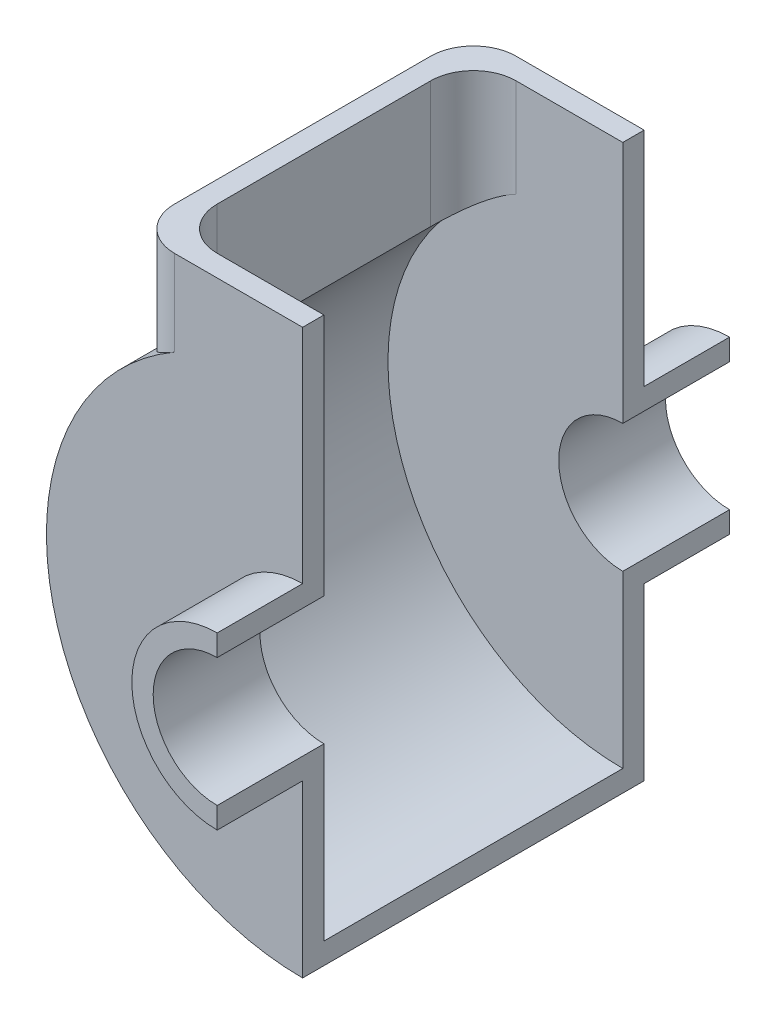
ISO-10303-21;
HEADER;
FILE_DESCRIPTION(('STEP AP214'),'2;1');
FILE_NAME('part.step','',(''),(''),'','','');
FILE_SCHEMA(('AUTOMOTIVE_DESIGN { 1 0 10303 214 1 1 1 1 }'));
ENDSEC;
DATA;
#1=APPLICATION_CONTEXT('core data for automotive mechanical design processes');
#2=APPLICATION_PROTOCOL_DEFINITION('international standard','automotive_design',2000,#1);
#3=PRODUCT_CONTEXT('',#1,'mechanical');
#4=PRODUCT('Part','Part','',(#3));
#5=PRODUCT_RELATED_PRODUCT_CATEGORY('part','',(#4));
#6=PRODUCT_DEFINITION_FORMATION('','',#4);
#7=PRODUCT_DEFINITION_CONTEXT('part definition',#1,'design');
#8=PRODUCT_DEFINITION('design','',#6,#7);
#9=PRODUCT_DEFINITION_SHAPE('','',#8);
#10=(LENGTH_UNIT() NAMED_UNIT(*) SI_UNIT(.MILLI.,.METRE.));
#11=(NAMED_UNIT(*) PLANE_ANGLE_UNIT() SI_UNIT($,.RADIAN.));
#12=(NAMED_UNIT(*) SI_UNIT($,.STERADIAN.) SOLID_ANGLE_UNIT());
#13=UNCERTAINTY_MEASURE_WITH_UNIT(LENGTH_MEASURE(1.E-05),#10,'distance_accuracy_value','');
#14=(GEOMETRIC_REPRESENTATION_CONTEXT(3) GLOBAL_UNCERTAINTY_ASSIGNED_CONTEXT((#13)) GLOBAL_UNIT_ASSIGNED_CONTEXT((#10,
#11,#12)) REPRESENTATION_CONTEXT('',''));
#15=CARTESIAN_POINT('',(0.,0.,0.));
#16=DIRECTION('',(0.,0.,1.));
#17=DIRECTION('',(1.,0.,0.));
#18=AXIS2_PLACEMENT_3D('',#15,#16,#17);
#19=CARTESIAN_POINT('',(0.,0.,0.));
#20=DIRECTION('',(0.,0.,1.));
#21=DIRECTION('',(1.,0.,0.));
#22=AXIS2_PLACEMENT_3D('',#19,#20,#21);
#23=PLANE('',#22);
#24=CARTESIAN_POINT('',(0.,0.,0.));
#25=DIRECTION('',(0.,0.,1.));
#26=DIRECTION('',(1.,0.,0.));
#27=AXIS2_PLACEMENT_3D('',#24,#25,#26);
#28=CIRCLE('',#27,55.);
#29=CARTESIAN_POINT('',(-25.,48.9897948556636,0.));
#30=VERTEX_POINT('',#29);
#31=CARTESIAN_POINT('',(0.,-55.,0.));
#32=VERTEX_POINT('',#31);
#33=EDGE_CURVE('E262',#30,#32,#28,.T.);
#34=ORIENTED_EDGE('',*,*,#33,.F.);
#35=DIRECTION('',(0.,-1.,0.));
#36=VECTOR('',#35,1.);
#37=CARTESIAN_POINT('',(-25.,72.,0.));
#38=LINE('',#37,#36);
#39=CARTESIAN_POINT('',(-25.,72.,0.));
#40=VERTEX_POINT('',#39);
#41=EDGE_CURVE('E406',#30,#40,#38,.F.);
#42=ORIENTED_EDGE('',*,*,#41,.T.);
#43=DIRECTION('',(-1.,0.,0.));
#44=VECTOR('',#43,1.);
#45=CARTESIAN_POINT('',(0.,72.,0.));
#46=LINE('',#45,#44);
#47=CARTESIAN_POINT('',(0.,72.,0.));
#48=VERTEX_POINT('',#47);
#49=EDGE_CURVE('E318',#48,#40,#46,.T.);
#50=ORIENTED_EDGE('',*,*,#49,.F.);
#51=DIRECTION('',(0.,1.,0.));
#52=VECTOR('',#51,1.);
#53=CARTESIAN_POINT('',(0.,0.,0.));
#54=LINE('',#53,#52);
#55=CARTESIAN_POINT('',(0.,15.,0.));
#56=VERTEX_POINT('',#55);
#57=EDGE_CURVE('E335',#56,#48,#54,.T.);
#58=ORIENTED_EDGE('',*,*,#57,.F.);
#59=CARTESIAN_POINT('',(0.,0.,0.));
#60=DIRECTION('',(0.,0.,1.));
#61=DIRECTION('',(1.,0.,0.));
#62=AXIS2_PLACEMENT_3D('',#59,#60,#61);
#63=CIRCLE('',#62,15.);
#64=CARTESIAN_POINT('',(0.,-15.,0.));
#65=VERTEX_POINT('',#64);
#66=EDGE_CURVE('E266',#56,#65,#63,.T.);
#67=ORIENTED_EDGE('',*,*,#66,.T.);
#68=DIRECTION('',(0.,-1.,0.));
#69=VECTOR('',#68,1.);
#70=CARTESIAN_POINT('',(0.,0.,0.));
#71=LINE('',#70,#69);
#72=EDGE_CURVE('E313',#65,#32,#71,.T.);
#73=ORIENTED_EDGE('',*,*,#72,.T.);
#74=EDGE_LOOP('',(#34,#42,#50,#58,#67,#73));
#75=FACE_BOUND('',#74,.T.);
#76=ADVANCED_FACE('F45',(#75),#23,.F.);
#77=CARTESIAN_POINT('',(-40.,0.,5.));
#78=DIRECTION('',(1.,0.,0.));
#79=DIRECTION('',(0.,1.,0.));
#80=AXIS2_PLACEMENT_3D('',#77,#78,#79);
#81=PLANE('',#80);
#82=DIRECTION('',(0.,0.,-1.));
#83=VECTOR('',#82,1.);
#84=CARTESIAN_POINT('',(-40.,44.7213595499958,5.));
#85=LINE('',#84,#83);
#86=CARTESIAN_POINT('',(-40.,44.7213595499958,-5.));
#87=VERTEX_POINT('',#86);
#88=CARTESIAN_POINT('',(-40.,44.7213595499958,-65.));
#89=VERTEX_POINT('',#88);
#90=EDGE_CURVE('E350',#87,#89,#85,.T.);
#91=ORIENTED_EDGE('',*,*,#90,.F.);
#92=DIRECTION('',(0.,-1.,0.));
#93=VECTOR('',#92,1.);
#94=CARTESIAN_POINT('',(-40.,72.,-5.));
#95=LINE('',#94,#93);
#96=CARTESIAN_POINT('',(-40.,72.,-5.));
#97=VERTEX_POINT('',#96);
#98=EDGE_CURVE('E466',#87,#97,#95,.F.);
#99=ORIENTED_EDGE('',*,*,#98,.T.);
#100=DIRECTION('',(0.,0.,-1.));
#101=VECTOR('',#100,1.);
#102=CARTESIAN_POINT('',(-40.,72.,5.));
#103=LINE('',#102,#101);
#104=CARTESIAN_POINT('',(-40.,72.,-65.));
#105=VERTEX_POINT('',#104);
#106=EDGE_CURVE('E332',#97,#105,#103,.T.);
#107=ORIENTED_EDGE('',*,*,#106,.T.);
#108=DIRECTION('',(0.,-1.,0.));
#109=VECTOR('',#108,1.);
#110=CARTESIAN_POINT('',(-40.,44.7213595499958,-65.));
#111=LINE('',#110,#109);
#112=EDGE_CURVE('E353',#105,#89,#111,.T.);
#113=ORIENTED_EDGE('',*,*,#112,.T.);
#114=EDGE_LOOP('',(#91,#99,#107,#113));
#115=FACE_BOUND('',#114,.T.);
#116=ADVANCED_FACE('F386',(#115),#81,.F.);
#117=CARTESIAN_POINT('',(0.,0.,5.));
#118=DIRECTION('',(0.,0.,-1.));
#119=DIRECTION('',(-1.,0.,0.));
#120=AXIS2_PLACEMENT_3D('',#117,#118,#119);
#121=CYLINDRICAL_SURFACE('',#120,60.);
#122=CARTESIAN_POINT('',(0.,0.,5.));
#123=DIRECTION('',(0.,0.,1.));
#124=DIRECTION('',(1.,0.,0.));
#125=AXIS2_PLACEMENT_3D('',#122,#123,#124);
#126=CIRCLE('',#125,60.);
#127=CARTESIAN_POINT('',(-30.,51.9615242270663,5.));
#128=VERTEX_POINT('',#127);
#129=CARTESIAN_POINT('',(0.,-60.,5.));
#130=VERTEX_POINT('',#129);
#131=EDGE_CURVE('E314',#128,#130,#126,.T.);
#132=ORIENTED_EDGE('',*,*,#131,.F.);
#133=CARTESIAN_POINT('',(-30.,51.9615242270663,5.));
#134=CARTESIAN_POINT('',(-30.1846403402757,51.8549243575684,4.99999694467445));
#135=CARTESIAN_POINT('',(-30.3686755821332,51.7473565843307,4.99488587812623));
#136=CARTESIAN_POINT('',(-30.7351668388072,51.5305231450817,4.97462918627216));
#137=CARTESIAN_POINT('',(-30.9176229894397,51.4212576273974,4.95948443281986));
#138=CARTESIAN_POINT('',(-31.4619253243051,51.0913595980358,4.89929167200636));
#139=CARTESIAN_POINT('',(-31.8209014856786,50.868512343648,4.83948477245505));
#140=CARTESIAN_POINT('',(-32.5288887310146,50.418725257113,4.6817684192746));
#141=CARTESIAN_POINT('',(-32.8778736192083,50.1917768316844,4.5837671788936));
#142=CARTESIAN_POINT('',(-33.562476910193,49.7365966241752,4.35090696893926));
#143=CARTESIAN_POINT('',(-33.8980954977704,49.5083648598861,4.21604850911225));
#144=CARTESIAN_POINT('',(-34.520729602458,49.0759439346811,3.92574534472068));
#145=CARTESIAN_POINT('',(-34.8092512536601,48.8716304811259,3.77370267176126));
#146=CARTESIAN_POINT('',(-35.3716903107987,48.4661085573826,3.44107089228342));
#147=CARTESIAN_POINT('',(-35.6456079007732,48.2649000480892,3.26048214561176));
#148=CARTESIAN_POINT('',(-36.1765727574088,47.8682074936152,2.87135112309205));
#149=CARTESIAN_POINT('',(-36.4336405194033,47.6727166603459,2.66284378257166));
#150=CARTESIAN_POINT('',(-36.9290721152615,47.289972828363,2.21794621899144));
#151=CARTESIAN_POINT('',(-37.167441451851,47.1027174132443,1.98156425075618));
#152=CARTESIAN_POINT('',(-37.565018182153,46.785859634165,1.54478146403292));
#153=CARTESIAN_POINT('',(-37.7289458526818,46.6537017113221,1.35050833176436));
#154=CARTESIAN_POINT('',(-38.043765038696,46.397339573439,0.946710505836686));
#155=CARTESIAN_POINT('',(-38.1946575996422,46.2731347207424,0.737187037795445));
#156=CARTESIAN_POINT('',(-38.4818360085844,46.0345861261904,0.303399948510736));
#157=CARTESIAN_POINT('',(-38.618136880254,45.9202322658759,0.0791518792914335));
#158=CARTESIAN_POINT('',(-38.8746918035924,45.7032445431668,-0.383743447816966));
#159=CARTESIAN_POINT('',(-38.9949492411763,45.6006082084878,-0.62238765196006));
#160=CARTESIAN_POINT('',(-39.1965662504922,45.4273417305266,-1.06669402634214));
#161=CARTESIAN_POINT('',(-39.2809795718103,45.3543309967536,-1.27004581930021));
#162=CARTESIAN_POINT('',(-39.437114382813,45.2186323209963,-1.68488791321454));
#163=CARTESIAN_POINT('',(-39.508838494378,45.1559422467147,-1.89637652189831));
#164=CARTESIAN_POINT('',(-39.6385128100447,45.0421551914612,-2.32617263610176));
#165=CARTESIAN_POINT('',(-39.6964869139818,44.9910381018204,-2.54446755239787));
#166=CARTESIAN_POINT('',(-39.7978943535571,44.9013606141582,-2.98685266600599));
#167=CARTESIAN_POINT('',(-39.8413328734582,44.8627957393971,-3.21094076633609));
#168=CARTESIAN_POINT('',(-39.9177189665931,44.7948514731765,-3.6937744282411));
#169=CARTESIAN_POINT('',(-39.9484884415044,44.7673886419263,-3.95314914513774));
#170=CARTESIAN_POINT('',(-39.9793476433001,44.7398248250479,-4.34440444684135));
#171=CARTESIAN_POINT('',(-39.987084921451,44.7329085695169,-4.47527578752073));
#172=CARTESIAN_POINT('',(-39.9974129661721,44.7236736235071,-4.73742237599204));
#173=CARTESIAN_POINT('',(-40.0000021863485,44.7213563144782,-4.86869773328782));
#174=CARTESIAN_POINT('',(-40.,44.7213595499958,-5.));
#175=B_SPLINE_CURVE_WITH_KNOTS('',3,(#133,#134,#135,#136,#137,#138,#139,#140,#141,#142,#143,
#144,#145,#146,#147,#148,#149,#150,#151,#152,#153,#154,#155,#156,#157,#158,#159,#160,#161,#162,
#163,#164,#165,#166,#167,#168,#169,#170,#171,#172,#173,#174),.UNSPECIFIED.,.F.,.F.,(4,2,2,2,2,2,
2,2,2,2,2,2,2,2,2,2,2,2,2,2,4),(0.,0.639469988122806,1.27888441829631,2.55703672344089,
3.83827975129429,5.11950506007104,6.27274736359203,7.42597513070353,8.5777730871098,
9.72923080131074,10.5879927572485,11.4466857734357,12.3044859953459,13.1621048939207,
13.8573439066469,14.5524390989254,15.2463170957639,15.9399473495783,16.7262834977137,
17.1199731890566,17.5137811205932),.UNSPECIFIED.);
#176=EDGE_CURVE('E393',#128,#87,#175,.T.);
#177=ORIENTED_EDGE('',*,*,#176,.T.);
#178=ORIENTED_EDGE('',*,*,#90,.T.);
#179=CARTESIAN_POINT('',(-40.,44.7213595499958,-65.));
#180=CARTESIAN_POINT('',(-40.0000015812733,44.7213573011344,-65.1176634010021));
#181=CARTESIAN_POINT('',(-39.9979227141808,44.7232176305845,-65.2353086549857));
#182=CARTESIAN_POINT('',(-39.9896253110866,44.7306372942271,-65.4703286016599));
#183=CARTESIAN_POINT('',(-39.9834070494192,44.7361963832882,-65.5877033117632));
#184=CARTESIAN_POINT('',(-39.9585923280535,44.7583670958171,-65.9388427467586));
#185=CARTESIAN_POINT('',(-39.9338358355778,44.7804722797486,-66.1718758054602));
#186=CARTESIAN_POINT('',(-39.8686644525486,44.8385042167555,-66.6318691326489));
#187=CARTESIAN_POINT('',(-39.8283855148165,44.8743109465834,-66.8588643223737));
#188=CARTESIAN_POINT('',(-39.7328892662281,44.9588875680342,-67.3072524479117));
#189=CARTESIAN_POINT('',(-39.6776696039361,45.0076595001554,-67.5286444958756));
#190=CARTESIAN_POINT('',(-39.5534118644793,45.1168972505339,-67.9636688649734));
#191=CARTESIAN_POINT('',(-39.4844211995899,45.1773229225701,-68.1773249178853));
#192=CARTESIAN_POINT('',(-39.3334605195833,45.3088170177995,-68.5966936542645));
#193=CARTESIAN_POINT('',(-39.2514857085459,45.3798893730022,-68.8024033675523));
#194=CARTESIAN_POINT('',(-39.0753863002099,45.5316122169457,-69.2054529377369));
#195=CARTESIAN_POINT('',(-38.9812363061758,45.6122826978885,-69.4027741200323));
#196=CARTESIAN_POINT('',(-38.7818943790383,45.7818938454653,-69.7880467498959));
#197=CARTESIAN_POINT('',(-38.6767013504078,45.8708353325264,-69.9759972651116));
#198=CARTESIAN_POINT('',(-38.4135728743112,46.0916172160901,-70.4129070483267));
#199=CARTESIAN_POINT('',(-38.2509572804996,46.2267600621542,-70.6573967975822));
#200=CARTESIAN_POINT('',(-37.908447036405,46.5080507377658,-71.1270697633622));
#201=CARTESIAN_POINT('',(-37.728551713043,46.6541989959475,-71.3522522271834));
#202=CARTESIAN_POINT('',(-37.3531054007839,46.9553345195759,-71.783333742699));
#203=CARTESIAN_POINT('',(-37.1575367002328,47.1103317262239,-71.9892103913973));
#204=CARTESIAN_POINT('',(-36.7525951751676,47.4269223387039,-72.3811838692743));
#205=CARTESIAN_POINT('',(-36.5432234671629,47.5885152106185,-72.5672822951176));
#206=CARTESIAN_POINT('',(-35.889352420626,48.0859277319981,-73.1015951815724));
#207=CARTESIAN_POINT('',(-35.4251261289153,48.429498559668,-73.4189829871174));
#208=CARTESIAN_POINT('',(-34.4553726874119,49.1241578823887,-73.9699716496598));
#209=CARTESIAN_POINT('',(-33.9498747171002,49.4752409388269,-74.2036310842669));
#210=CARTESIAN_POINT('',(-33.1568278633415,50.0073212539565,-74.4930456878643));
#211=CARTESIAN_POINT('',(-32.8810021018505,50.1891501210001,-74.5803819665683));
#212=CARTESIAN_POINT('',(-32.3217375725054,50.5511235483305,-74.7310524671282));
#213=CARTESIAN_POINT('',(-32.0382991780871,50.7312681906542,-74.7943878640466));
#214=CARTESIAN_POINT('',(-31.4650006560555,51.0888227050653,-74.8963939978526));
#215=CARTESIAN_POINT('',(-31.1751356203563,51.2662302982853,-74.935045161166));
#216=CARTESIAN_POINT('',(-30.5906934832528,51.6171131325133,-74.9868485137105));
#217=CARTESIAN_POINT('',(-30.2961152167169,51.7905873747387,-74.9999942965489));
#218=CARTESIAN_POINT('',(-30.,51.9615242270663,-75.));
#219=B_SPLINE_CURVE_WITH_KNOTS('',3,(#179,#180,#181,#182,#183,#184,#185,#186,#187,#188,#189,
#190,#191,#192,#193,#194,#195,#196,#197,#198,#199,#200,#201,#202,#203,#204,#205,#206,#207,#208,
#209,#210,#211,#212,#213,#214,#215,#216,#217,#218),.UNSPECIFIED.,.F.,.F.,(4,2,2,2,2,2,2,2,2,2,2,
2,2,2,2,2,2,2,2,4),(0.,0.352921378883185,0.705819370583158,1.41085932128629,2.10985961734753,
2.80896998914977,3.50571366437716,4.2027152967345,4.90119502233957,5.59974410640153,
6.56805788163329,7.53640938987799,8.50587104319847,9.47525437387456,11.4447404103531,
13.4128458625583,14.4372042618812,15.4615125030147,16.4866319729198,17.5120088970542),.UNSPECIFIED.);
#220=CARTESIAN_POINT('',(-30.,51.9615242270663,-75.));
#221=VERTEX_POINT('',#220);
#222=EDGE_CURVE('E364',#89,#221,#219,.T.);
#223=ORIENTED_EDGE('',*,*,#222,.T.);
#224=CARTESIAN_POINT('',(0.,0.,-75.));
#225=DIRECTION('',(0.,0.,1.));
#226=DIRECTION('',(1.,0.,0.));
#227=AXIS2_PLACEMENT_3D('',#224,#225,#226);
#228=CIRCLE('',#227,60.);
#229=CARTESIAN_POINT('',(0.,-60.,-75.));
#230=VERTEX_POINT('',#229);
#231=EDGE_CURVE('E229',#221,#230,#228,.T.);
#232=ORIENTED_EDGE('',*,*,#231,.T.);
#233=DIRECTION('',(0.,0.,-1.));
#234=VECTOR('',#233,1.);
#235=CARTESIAN_POINT('',(0.,-60.,5.));
#236=LINE('',#235,#234);
#237=EDGE_CURVE('E347',#130,#230,#236,.T.);
#238=ORIENTED_EDGE('',*,*,#237,.F.);
#239=EDGE_LOOP('',(#132,#177,#178,#223,#232,#238));
#240=FACE_BOUND('',#239,.T.);
#241=ADVANCED_FACE('F376',(#240),#121,.T.);
#242=CARTESIAN_POINT('',(0.,0.,5.));
#243=DIRECTION('',(1.,0.,0.));
#244=DIRECTION('',(0.,1.,0.));
#245=AXIS2_PLACEMENT_3D('',#242,#243,#244);
#246=PLANE('',#245);
#247=ORIENTED_EDGE('',*,*,#72,.F.);
#248=DIRECTION('',(0.,0.,-1.));
#249=VECTOR('',#248,1.);
#250=CARTESIAN_POINT('',(0.,-15.,25.));
#251=LINE('',#250,#249);
#252=CARTESIAN_POINT('',(0.,-15.,25.));
#253=VERTEX_POINT('',#252);
#254=EDGE_CURVE('E302',#253,#65,#251,.T.);
#255=ORIENTED_EDGE('',*,*,#254,.F.);
#256=DIRECTION('',(0.,-1.,0.));
#257=VECTOR('',#256,1.);
#258=CARTESIAN_POINT('',(0.,0.,25.));
#259=LINE('',#258,#257);
#260=CARTESIAN_POINT('',(0.,-20.,25.));
#261=VERTEX_POINT('',#260);
#262=EDGE_CURVE('E287',#253,#261,#259,.T.);
#263=ORIENTED_EDGE('',*,*,#262,.T.);
#264=DIRECTION('',(0.,0.,-1.));
#265=VECTOR('',#264,1.);
#266=CARTESIAN_POINT('',(0.,-20.,25.));
#267=LINE('',#266,#265);
#268=CARTESIAN_POINT('',(0.,-20.,5.));
#269=VERTEX_POINT('',#268);
#270=EDGE_CURVE('E306',#261,#269,#267,.T.);
#271=ORIENTED_EDGE('',*,*,#270,.T.);
#272=DIRECTION('',(0.,-1.,0.));
#273=VECTOR('',#272,1.);
#274=CARTESIAN_POINT('',(0.,0.,5.));
#275=LINE('',#274,#273);
#276=EDGE_CURVE('E317',#269,#130,#275,.T.);
#277=ORIENTED_EDGE('',*,*,#276,.T.);
#278=ORIENTED_EDGE('',*,*,#237,.T.);
#279=DIRECTION('',(0.,-1.,0.));
#280=VECTOR('',#279,1.);
#281=CARTESIAN_POINT('',(0.,0.,-75.));
#282=LINE('',#281,#280);
#283=CARTESIAN_POINT('',(0.,-20.,-75.));
#284=VERTEX_POINT('',#283);
#285=EDGE_CURVE('E233',#284,#230,#282,.T.);
#286=ORIENTED_EDGE('',*,*,#285,.F.);
#287=DIRECTION('',(0.,0.,1.));
#288=VECTOR('',#287,1.);
#289=CARTESIAN_POINT('',(0.,-20.,-95.));
#290=LINE('',#289,#288);
#291=CARTESIAN_POINT('',(0.,-20.,-95.));
#292=VERTEX_POINT('',#291);
#293=EDGE_CURVE('E204',#292,#284,#290,.T.);
#294=ORIENTED_EDGE('',*,*,#293,.F.);
#295=DIRECTION('',(0.,-1.,0.));
#296=VECTOR('',#295,1.);
#297=CARTESIAN_POINT('',(0.,0.,-95.));
#298=LINE('',#297,#296);
#299=CARTESIAN_POINT('',(0.,-15.,-95.));
#300=VERTEX_POINT('',#299);
#301=EDGE_CURVE('E189',#300,#292,#298,.T.);
#302=ORIENTED_EDGE('',*,*,#301,.F.);
#303=DIRECTION('',(0.,0.,1.));
#304=VECTOR('',#303,1.);
#305=CARTESIAN_POINT('',(0.,-15.,-95.));
#306=LINE('',#305,#304);
#307=CARTESIAN_POINT('',(0.,-15.,-70.));
#308=VERTEX_POINT('',#307);
#309=EDGE_CURVE('E223',#300,#308,#306,.T.);
#310=ORIENTED_EDGE('',*,*,#309,.T.);
#311=DIRECTION('',(0.,-1.,0.));
#312=VECTOR('',#311,1.);
#313=CARTESIAN_POINT('',(0.,0.,-70.));
#314=LINE('',#313,#312);
#315=CARTESIAN_POINT('',(0.,-55.,-70.));
#316=VERTEX_POINT('',#315);
#317=EDGE_CURVE('E203',#308,#316,#314,.T.);
#318=ORIENTED_EDGE('',*,*,#317,.T.);
#319=DIRECTION('',(0.,0.,1.));
#320=VECTOR('',#319,1.);
#321=CARTESIAN_POINT('',(0.,-55.,-95.002));
#322=LINE('',#321,#320);
#323=EDGE_CURVE('E268',#316,#32,#322,.T.);
#324=ORIENTED_EDGE('',*,*,#323,.T.);
#325=EDGE_LOOP('',(#247,#255,#263,#271,#277,#278,#286,#294,#302,#310,#318,#324));
#326=FACE_BOUND('',#325,.T.);
#327=ADVANCED_FACE('F485',(#326),#246,.T.);
#328=CARTESIAN_POINT('',(0.,0.,5.));
#329=DIRECTION('',(-1.,0.,0.));
#330=DIRECTION('',(0.,0.,1.));
#331=AXIS2_PLACEMENT_3D('',#328,#329,#330);
#332=PLANE('',#331);
#333=ORIENTED_EDGE('',*,*,#57,.T.);
#334=DIRECTION('',(0.,0.,-1.));
#335=VECTOR('',#334,1.);
#336=CARTESIAN_POINT('',(0.,72.,5.));
#337=LINE('',#336,#335);
#338=CARTESIAN_POINT('',(0.,72.,5.));
#339=VERTEX_POINT('',#338);
#340=EDGE_CURVE('E343',#339,#48,#337,.T.);
#341=ORIENTED_EDGE('',*,*,#340,.F.);
#342=DIRECTION('',(0.,1.,0.));
#343=VECTOR('',#342,1.);
#344=CARTESIAN_POINT('',(0.,0.,5.));
#345=LINE('',#344,#343);
#346=CARTESIAN_POINT('',(0.,20.,5.));
#347=VERTEX_POINT('',#346);
#348=EDGE_CURVE('E325',#347,#339,#345,.T.);
#349=ORIENTED_EDGE('',*,*,#348,.F.);
#350=DIRECTION('',(0.,0.,-1.));
#351=VECTOR('',#350,1.);
#352=CARTESIAN_POINT('',(0.,20.,25.));
#353=LINE('',#352,#351);
#354=CARTESIAN_POINT('',(0.,20.,25.));
#355=VERTEX_POINT('',#354);
#356=EDGE_CURVE('E310',#355,#347,#353,.T.);
#357=ORIENTED_EDGE('',*,*,#356,.F.);
#358=DIRECTION('',(0.,-1.,0.));
#359=VECTOR('',#358,1.);
#360=CARTESIAN_POINT('',(0.,0.,25.));
#361=LINE('',#360,#359);
#362=CARTESIAN_POINT('',(0.,15.,25.));
#363=VERTEX_POINT('',#362);
#364=EDGE_CURVE('E280',#355,#363,#361,.T.);
#365=ORIENTED_EDGE('',*,*,#364,.T.);
#366=DIRECTION('',(0.,0.,-1.));
#367=VECTOR('',#366,1.);
#368=CARTESIAN_POINT('',(0.,15.,25.));
#369=LINE('',#368,#367);
#370=EDGE_CURVE('E295',#363,#56,#369,.T.);
#371=ORIENTED_EDGE('',*,*,#370,.T.);
#372=EDGE_LOOP('',(#333,#341,#349,#357,#365,#371));
#373=FACE_BOUND('',#372,.T.);
#374=ADVANCED_FACE('F508',(#373),#332,.F.);
#375=CARTESIAN_POINT('',(0.,72.,5.));
#376=DIRECTION('',(0.,-1.,0.));
#377=DIRECTION('',(1.,0.,0.));
#378=AXIS2_PLACEMENT_3D('',#375,#376,#377);
#379=PLANE('',#378);
#380=ORIENTED_EDGE('',*,*,#106,.F.);
#381=CARTESIAN_POINT('',(-30.,72.,-5.));
#382=DIRECTION('',(0.,-1.,0.));
#383=DIRECTION('',(1.,0.,0.));
#384=AXIS2_PLACEMENT_3D('',#381,#382,#383);
#385=CIRCLE('',#384,10.);
#386=CARTESIAN_POINT('',(-30.,72.,5.));
#387=VERTEX_POINT('',#386);
#388=EDGE_CURVE('E402',#97,#387,#385,.F.);
#389=ORIENTED_EDGE('',*,*,#388,.T.);
#390=DIRECTION('',(-1.,0.,0.));
#391=VECTOR('',#390,1.);
#392=CARTESIAN_POINT('',(0.,72.,5.));
#393=LINE('',#392,#391);
#394=EDGE_CURVE('E328',#339,#387,#393,.T.);
#395=ORIENTED_EDGE('',*,*,#394,.F.);
#396=ORIENTED_EDGE('',*,*,#340,.T.);
#397=ORIENTED_EDGE('',*,*,#49,.T.);
#398=CARTESIAN_POINT('',(-25.,72.,-9.99999999999999));
#399=DIRECTION('',(0.,-1.,0.));
#400=DIRECTION('',(1.,0.,0.));
#401=AXIS2_PLACEMENT_3D('',#398,#399,#400);
#402=CIRCLE('',#401,10.);
#403=CARTESIAN_POINT('',(-35.,72.,-9.99999999999999));
#404=VERTEX_POINT('',#403);
#405=EDGE_CURVE('E418',#40,#404,#402,.T.);
#406=ORIENTED_EDGE('',*,*,#405,.T.);
#407=DIRECTION('',(0.,0.,1.));
#408=VECTOR('',#407,1.);
#409=CARTESIAN_POINT('',(-35.,72.,-95.002));
#410=LINE('',#409,#408);
#411=CARTESIAN_POINT('',(-35.,72.,-60.));
#412=VERTEX_POINT('',#411);
#413=EDGE_CURVE('E267',#412,#404,#410,.T.);
#414=ORIENTED_EDGE('',*,*,#413,.F.);
#415=CARTESIAN_POINT('',(-25.,72.,-60.));
#416=DIRECTION('',(0.,-1.,0.));
#417=DIRECTION('',(1.,0.,0.));
#418=AXIS2_PLACEMENT_3D('',#415,#416,#417);
#419=CIRCLE('',#418,10.);
#420=CARTESIAN_POINT('',(-25.,72.,-70.));
#421=VERTEX_POINT('',#420);
#422=EDGE_CURVE('E11',#412,#421,#419,.T.);
#423=ORIENTED_EDGE('',*,*,#422,.T.);
#424=DIRECTION('',(-1.,0.,0.));
#425=VECTOR('',#424,1.);
#426=CARTESIAN_POINT('',(0.,72.,-70.));
#427=LINE('',#426,#425);
#428=CARTESIAN_POINT('',(0.,72.,-70.));
#429=VERTEX_POINT('',#428);
#430=EDGE_CURVE('E234',#429,#421,#427,.T.);
#431=ORIENTED_EDGE('',*,*,#430,.F.);
#432=DIRECTION('',(0.,0.,1.));
#433=VECTOR('',#432,1.);
#434=CARTESIAN_POINT('',(0.,72.,-75.));
#435=LINE('',#434,#433);
#436=CARTESIAN_POINT('',(0.,72.,-75.));
#437=VERTEX_POINT('',#436);
#438=EDGE_CURVE('E247',#437,#429,#435,.T.);
#439=ORIENTED_EDGE('',*,*,#438,.F.);
#440=DIRECTION('',(-1.,0.,0.));
#441=VECTOR('',#440,1.);
#442=CARTESIAN_POINT('',(0.,72.,-75.));
#443=LINE('',#442,#441);
#444=CARTESIAN_POINT('',(-30.,72.,-75.));
#445=VERTEX_POINT('',#444);
#446=EDGE_CURVE('E243',#437,#445,#443,.T.);
#447=ORIENTED_EDGE('',*,*,#446,.T.);
#448=CARTESIAN_POINT('',(-30.,72.,-65.));
#449=DIRECTION('',(0.,-1.,0.));
#450=DIRECTION('',(1.,0.,0.));
#451=AXIS2_PLACEMENT_3D('',#448,#449,#450);
#452=CIRCLE('',#451,10.);
#453=EDGE_CURVE('E360',#445,#105,#452,.F.);
#454=ORIENTED_EDGE('',*,*,#453,.T.);
#455=EDGE_LOOP('',(#380,#389,#395,#396,#397,#406,#414,#423,#431,#439,#447,#454));
#456=FACE_BOUND('',#455,.T.);
#457=ADVANCED_FACE('F449',(#456),#379,.F.);
#458=CARTESIAN_POINT('',(0.,0.,5.));
#459=DIRECTION('',(0.,0.,1.));
#460=DIRECTION('',(1.,0.,0.));
#461=AXIS2_PLACEMENT_3D('',#458,#459,#460);
#462=PLANE('',#461);
#463=ORIENTED_EDGE('',*,*,#394,.T.);
#464=DIRECTION('',(0.,-1.,0.));
#465=VECTOR('',#464,1.);
#466=CARTESIAN_POINT('',(-30.,44.7213595499958,5.));
#467=LINE('',#466,#465);
#468=EDGE_CURVE('E374',#387,#128,#467,.T.);
#469=ORIENTED_EDGE('',*,*,#468,.T.);
#470=ORIENTED_EDGE('',*,*,#131,.T.);
#471=ORIENTED_EDGE('',*,*,#276,.F.);
#472=CARTESIAN_POINT('',(0.,0.,5.));
#473=DIRECTION('',(0.,0.,1.));
#474=DIRECTION('',(1.,0.,0.));
#475=AXIS2_PLACEMENT_3D('',#472,#473,#474);
#476=CIRCLE('',#475,20.);
#477=EDGE_CURVE('E322',#347,#269,#476,.T.);
#478=ORIENTED_EDGE('',*,*,#477,.F.);
#479=ORIENTED_EDGE('',*,*,#348,.T.);
#480=EDGE_LOOP('',(#463,#469,#470,#471,#478,#479));
#481=FACE_BOUND('',#480,.T.);
#482=ADVANCED_FACE('F476',(#481),#462,.T.);
#483=CARTESIAN_POINT('',(0.,0.,25.));
#484=DIRECTION('',(0.,0.,-1.));
#485=DIRECTION('',(-1.,0.,0.));
#486=AXIS2_PLACEMENT_3D('',#483,#484,#485);
#487=CYLINDRICAL_SURFACE('',#486,20.);
#488=ORIENTED_EDGE('',*,*,#477,.T.);
#489=ORIENTED_EDGE('',*,*,#270,.F.);
#490=CARTESIAN_POINT('',(0.,0.,25.));
#491=DIRECTION('',(0.,0.,1.));
#492=DIRECTION('',(1.,0.,0.));
#493=AXIS2_PLACEMENT_3D('',#490,#491,#492);
#494=CIRCLE('',#493,20.);
#495=EDGE_CURVE('E284',#355,#261,#494,.T.);
#496=ORIENTED_EDGE('',*,*,#495,.F.);
#497=ORIENTED_EDGE('',*,*,#356,.T.);
#498=EDGE_LOOP('',(#488,#489,#496,#497));
#499=FACE_BOUND('',#498,.T.);
#500=ADVANCED_FACE('F520',(#499),#487,.T.);
#501=CARTESIAN_POINT('',(0.,0.,25.));
#502=DIRECTION('',(0.,0.,-1.));
#503=DIRECTION('',(-1.,0.,0.));
#504=AXIS2_PLACEMENT_3D('',#501,#502,#503);
#505=CYLINDRICAL_SURFACE('',#504,15.);
#506=ORIENTED_EDGE('',*,*,#66,.F.);
#507=ORIENTED_EDGE('',*,*,#370,.F.);
#508=CARTESIAN_POINT('',(0.,0.,25.));
#509=DIRECTION('',(0.,0.,1.));
#510=DIRECTION('',(1.,0.,0.));
#511=AXIS2_PLACEMENT_3D('',#508,#509,#510);
#512=CIRCLE('',#511,15.);
#513=EDGE_CURVE('E291',#363,#253,#512,.T.);
#514=ORIENTED_EDGE('',*,*,#513,.T.);
#515=ORIENTED_EDGE('',*,*,#254,.T.);
#516=EDGE_LOOP('',(#506,#507,#514,#515));
#517=FACE_BOUND('',#516,.T.);
#518=ADVANCED_FACE('F526',(#517),#505,.F.);
#519=CARTESIAN_POINT('',(0.,0.,25.));
#520=DIRECTION('',(0.,0.,1.));
#521=DIRECTION('',(1.,0.,0.));
#522=AXIS2_PLACEMENT_3D('',#519,#520,#521);
#523=PLANE('',#522);
#524=ORIENTED_EDGE('',*,*,#364,.F.);
#525=ORIENTED_EDGE('',*,*,#495,.T.);
#526=ORIENTED_EDGE('',*,*,#262,.F.);
#527=ORIENTED_EDGE('',*,*,#513,.F.);
#528=EDGE_LOOP('',(#524,#525,#526,#527));
#529=FACE_BOUND('',#528,.T.);
#530=ADVANCED_FACE('F426',(#529),#523,.T.);
#531=CARTESIAN_POINT('',(0.,0.,-95.002));
#532=DIRECTION('',(0.,0.,1.));
#533=DIRECTION('',(1.,0.,0.));
#534=AXIS2_PLACEMENT_3D('',#531,#532,#533);
#535=CYLINDRICAL_SURFACE('',#534,55.);
#536=CARTESIAN_POINT('',(0.,0.,-70.));
#537=DIRECTION('',(0.,0.,-1.));
#538=DIRECTION('',(-1.,0.,0.));
#539=AXIS2_PLACEMENT_3D('',#536,#537,#538);
#540=CIRCLE('',#539,55.);
#541=CARTESIAN_POINT('',(-25.,48.9897948556636,-70.));
#542=VERTEX_POINT('',#541);
#543=EDGE_CURVE('E261',#542,#316,#540,.F.);
#544=ORIENTED_EDGE('',*,*,#543,.F.);
#545=CARTESIAN_POINT('',(-25.,48.9897948556636,-70.));
#546=CARTESIAN_POINT('',(-25.1906704625853,48.8924964907343,-69.9999971656189));
#547=CARTESIAN_POINT('',(-25.3807299051036,48.7941008127997,-69.9945462068009));
#548=CARTESIAN_POINT('',(-25.7591946792121,48.5953653194177,-69.9729416657178));
#549=CARTESIAN_POINT('',(-25.947600172291,48.4950256969118,-69.9567891403815));
#550=CARTESIAN_POINT('',(-26.5095199627771,48.1915584402701,-69.8925935595296));
#551=CARTESIAN_POINT('',(-26.879966617226,47.985865462464,-69.8288120264318));
#552=CARTESIAN_POINT('',(-27.6092367230561,47.5700172433392,-69.6608532752705));
#553=CARTESIAN_POINT('',(-27.9680515865194,47.3598588865119,-69.5566469152987));
#554=CARTESIAN_POINT('',(-28.6708870947942,46.9377053718885,-69.3093143170567));
#555=CARTESIAN_POINT('',(-29.0149087495746,46.7257103406777,-69.1661907406623));
#556=CARTESIAN_POINT('',(-29.6343122240442,46.3348745882726,-68.8669502099571));
#557=CARTESIAN_POINT('',(-29.9121762835488,46.1558947290866,-68.7161192793689));
#558=CARTESIAN_POINT('',(-30.453564058984,45.8004938086764,-68.3880155176435));
#559=CARTESIAN_POINT('',(-30.7170889667725,45.6240725356815,-68.210744888747));
#560=CARTESIAN_POINT('',(-31.2277793899634,45.27605554075,-67.8304558145634));
#561=CARTESIAN_POINT('',(-31.4749603097885,45.1044553652141,-67.6274621555615));
#562=CARTESIAN_POINT('',(-31.9512644556701,44.7683103206218,-67.1960491883292));
#563=CARTESIAN_POINT('',(-32.1803914213147,44.60376399371,-66.9676351692916));
#564=CARTESIAN_POINT('',(-32.5724334975713,44.3179704705642,-66.536394282226));
#565=CARTESIAN_POINT('',(-32.7391594522469,44.1948776144083,-66.3382416976568));
#566=CARTESIAN_POINT('',(-33.0586989979014,43.956366411861,-65.9266540781595));
#567=CARTESIAN_POINT('',(-33.2115135789464,43.8409475194751,-65.7132201327334));
#568=CARTESIAN_POINT('',(-33.5016809731427,43.6196131502261,-65.2717299317311));
#569=CARTESIAN_POINT('',(-33.6390478315194,43.5136890586718,-65.0436872596241));
#570=CARTESIAN_POINT('',(-33.8968966266417,43.3131282626193,-64.5735187782177));
#571=CARTESIAN_POINT('',(-34.0173818752135,43.2184893447453,-64.3313957444228));
#572=CARTESIAN_POINT('',(-34.220345560487,43.0578872759331,-63.8775967975981));
#573=CARTESIAN_POINT('',(-34.3057864350373,42.9898029979803,-63.6679931294044));
#574=CARTESIAN_POINT('',(-34.4630420236251,42.8638412603264,-63.2407750890927));
#575=CARTESIAN_POINT('',(-34.534859392632,42.805961812048,-63.023162287697));
#576=CARTESIAN_POINT('',(-34.6638213670323,42.7015968076424,-62.5813588577465));
#577=CARTESIAN_POINT('',(-34.7209903361364,42.6550923381947,-62.357179851681));
#578=CARTESIAN_POINT('',(-34.8199345283325,42.5743613090907,-61.9033665270967));
#579=CARTESIAN_POINT('',(-34.8617157478199,42.5401299669028,-61.6737343708085));
#580=CARTESIAN_POINT('',(-34.9300837462733,42.4840120509156,-61.2045822520297));
#581=CARTESIAN_POINT('',(-34.9562545186649,42.4624636500731,-60.9649596154708));
#582=CARTESIAN_POINT('',(-34.9824752970613,42.4408592306511,-60.6039690758757));
#583=CARTESIAN_POINT('',(-34.9890430057937,42.4354441063026,-60.4833431270819));
#584=CARTESIAN_POINT('',(-34.9978062165354,42.4282167617888,-60.241817657905));
#585=CARTESIAN_POINT('',(-35.0000014553635,42.4264047584974,-60.120918121493));
#586=CARTESIAN_POINT('',(-35.,42.4264068711928,-60.));
#587=B_SPLINE_CURVE_WITH_KNOTS('',3,(#545,#546,#547,#548,#549,#550,#551,#552,#553,#554,#555,
#556,#557,#558,#559,#560,#561,#562,#563,#564,#565,#566,#567,#568,#569,#570,#571,#572,#573,#574,
#575,#576,#577,#578,#579,#580,#581,#582,#583,#584,#585,#586),.UNSPECIFIED.,.F.,.F.,(4,2,2,2,2,2,
2,2,2,2,2,2,2,2,2,2,2,2,2,2,4),(0.,0.642025153546947,1.28398690760974,2.56714249695266,
3.85122482619341,5.13521934832298,6.22394893506149,7.31258788888127,8.40018571330232,
9.4875576637522,10.3469757139952,11.2063325519534,12.0649016266237,12.9233020310802,
13.6317123054177,14.3399843815419,15.0470706749441,15.7538811342204,16.4787715527391,
16.8414339261366,17.2041181277167),.UNSPECIFIED.);
#588=CARTESIAN_POINT('',(-35.,42.4264068711928,-60.));
#589=VERTEX_POINT('',#588);
#590=EDGE_CURVE('E55',#542,#589,#587,.T.);
#591=ORIENTED_EDGE('',*,*,#590,.T.);
#592=DIRECTION('',(0.,0.,1.));
#593=VECTOR('',#592,1.);
#594=CARTESIAN_POINT('',(-35.,42.4264068711928,-95.002));
#595=LINE('',#594,#593);
#596=CARTESIAN_POINT('',(-35.,42.4264068711928,-9.99999999999999));
#597=VERTEX_POINT('',#596);
#598=EDGE_CURVE('E272',#589,#597,#595,.T.);
#599=ORIENTED_EDGE('',*,*,#598,.T.);
#600=CARTESIAN_POINT('',(-35.,42.4264068711928,-9.99999999999999));
#601=CARTESIAN_POINT('',(-35.0000014497964,42.4264047837681,-9.87987310315719));
#602=CARTESIAN_POINT('',(-34.9978348514331,42.4281931348836,-9.75976422715493));
#603=CARTESIAN_POINT('',(-34.9891857816154,42.4353263709232,-9.51981491367695));
#604=CARTESIAN_POINT('',(-34.9827035721487,42.4406710399539,-9.39997446034919));
#605=CARTESIAN_POINT('',(-34.956830452997,42.4619893413881,-9.04141786262552));
#606=CARTESIAN_POINT('',(-34.9310129679865,42.4832473662838,-8.80342910014089));
#607=CARTESIAN_POINT('',(-34.8629816882097,42.5390927002779,-8.33339460407183));
#608=CARTESIAN_POINT('',(-34.8208989195309,42.5735734756723,-8.10131678852098));
#609=CARTESIAN_POINT('',(-34.7210380015034,42.6550543990627,-7.64278126517026));
#610=CARTESIAN_POINT('',(-34.6632576605496,42.7020562951679,-7.4163243469495));
#611=CARTESIAN_POINT('',(-34.5330883120894,42.807391745231,-6.97116269404727));
#612=CARTESIAN_POINT('',(-34.4607440027141,42.865690607765,-6.75243659053953));
#613=CARTESIAN_POINT('',(-34.3022805482754,42.9926022625577,-6.32304828482198));
#614=CARTESIAN_POINT('',(-34.2161564051557,43.061218796573,-6.11238904301828));
#615=CARTESIAN_POINT('',(-34.03096608752,43.2077227263221,-5.69966121720985));
#616=CARTESIAN_POINT('',(-33.9318751543174,43.2856278316291,-5.49761007347531));
#617=CARTESIAN_POINT('',(-33.7218564369498,43.4494435165854,-5.10314735561813));
#618=CARTESIAN_POINT('',(-33.610927467307,43.535354897885,-4.91073674975316));
#619=CARTESIAN_POINT('',(-33.3379150398717,43.7449695332966,-4.47123433911837));
#620=CARTESIAN_POINT('',(-33.1713989056376,43.87147497144,-4.22821699400697));
#621=CARTESIAN_POINT('',(-32.820669795309,44.1344729444258,-3.76121521493266));
#622=CARTESIAN_POINT('',(-32.6364569574066,44.2709654012783,-3.53723063237016));
#623=CARTESIAN_POINT('',(-32.2518815980921,44.5519118289509,-3.10846762196946));
#624=CARTESIAN_POINT('',(-32.0515019123395,44.6963742086041,-2.90371011997531));
#625=CARTESIAN_POINT('',(-31.6364068995163,44.9911403692426,-2.5140694607911));
#626=CARTESIAN_POINT('',(-31.4216926181168,45.1414437238107,-2.32918485648769));
#627=CARTESIAN_POINT('',(-30.7527718961723,45.6022087667656,-1.80053893105145));
#628=CARTESIAN_POINT('',(-30.2782224789075,45.9192504365907,-1.4876819776076));
#629=CARTESIAN_POINT('',(-29.2863950159429,46.5580783691839,-0.947634918697291));
#630=CARTESIAN_POINT('',(-28.7691524751348,46.8798605102554,-0.720374486477762));
#631=CARTESIAN_POINT('',(-27.9782964577458,47.3529868290529,-0.449937168922881));
#632=CARTESIAN_POINT('',(-27.71720700781,47.5063120740257,-0.372373069617562));
#633=CARTESIAN_POINT('',(-27.1884092746343,47.8109125009315,-0.238585466265289));
#634=CARTESIAN_POINT('',(-26.9207016309538,47.9621878787861,-0.182359908655269));
#635=CARTESIAN_POINT('',(-26.379727809034,48.2618435343977,-0.0918406003391308));
#636=CARTESIAN_POINT('',(-26.1064574293253,48.4102214444596,-0.0575641135549306));
#637=CARTESIAN_POINT('',(-25.5558838504953,48.703127245693,-0.011640079605015));
#638=CARTESIAN_POINT('',(-25.2785794886699,48.8476539914468,8.07737825414658E-07));
#639=CARTESIAN_POINT('',(-25.,48.9897948556636,0.));
#640=B_SPLINE_CURVE_WITH_KNOTS('',3,(#600,#601,#602,#603,#604,#605,#606,#607,#608,#609,#610,
#611,#612,#613,#614,#615,#616,#617,#618,#619,#620,#621,#622,#623,#624,#625,#626,#627,#628,#629,
#630,#631,#632,#633,#634,#635,#636,#637,#638,#639),.UNSPECIFIED.,.F.,.F.,(4,2,2,2,2,2,2,2,2,2,2,
2,2,2,2,2,2,2,2,4),(0.,0.360312293922661,0.720602716369276,1.44047421081293,2.15466369102644,
2.86895293355912,3.58108249267798,4.29347093489964,5.00724001410331,5.72108063834975,
6.68154144938632,7.64199476087041,8.60348155414834,9.56489828596206,11.5096170735251,
13.4527345617431,14.3897475989406,15.326670437678,16.2643293057158,17.2022640090674),.UNSPECIFIED.);
#641=EDGE_CURVE('E409',#597,#30,#640,.T.);
#642=ORIENTED_EDGE('',*,*,#641,.T.);
#643=ORIENTED_EDGE('',*,*,#33,.T.);
#644=ORIENTED_EDGE('',*,*,#323,.F.);
#645=EDGE_LOOP('',(#544,#591,#599,#642,#643,#644));
#646=FACE_BOUND('',#645,.T.);
#647=ADVANCED_FACE('F420',(#646),#535,.F.);
#648=CARTESIAN_POINT('',(-35.,72.,-95.002));
#649=DIRECTION('',(-1.,0.,0.));
#650=DIRECTION('',(0.,0.,1.));
#651=AXIS2_PLACEMENT_3D('',#648,#649,#650);
#652=PLANE('',#651);
#653=ORIENTED_EDGE('',*,*,#598,.F.);
#654=DIRECTION('',(0.,-1.,0.));
#655=VECTOR('',#654,1.);
#656=CARTESIAN_POINT('',(-35.,72.,-60.));
#657=LINE('',#656,#655);
#658=EDGE_CURVE('E68',#589,#412,#657,.F.);
#659=ORIENTED_EDGE('',*,*,#658,.T.);
#660=ORIENTED_EDGE('',*,*,#413,.T.);
#661=DIRECTION('',(0.,-1.,0.));
#662=VECTOR('',#661,1.);
#663=CARTESIAN_POINT('',(-35.,42.4264068711928,-9.99999999999999));
#664=LINE('',#663,#662);
#665=EDGE_CURVE('E401',#404,#597,#664,.T.);
#666=ORIENTED_EDGE('',*,*,#665,.T.);
#667=EDGE_LOOP('',(#653,#659,#660,#666));
#668=FACE_BOUND('',#667,.T.);
#669=ADVANCED_FACE('F425',(#668),#652,.F.);
#670=CARTESIAN_POINT('',(0.,0.,-70.));
#671=DIRECTION('',(0.,0.,-1.));
#672=DIRECTION('',(1.,0.,0.));
#673=AXIS2_PLACEMENT_3D('',#670,#671,#672);
#674=PLANE('',#673);
#675=ORIENTED_EDGE('',*,*,#430,.T.);
#676=DIRECTION('',(0.,-1.,0.));
#677=VECTOR('',#676,1.);
#678=CARTESIAN_POINT('',(-25.,42.4264068711928,-70.));
#679=LINE('',#678,#677);
#680=EDGE_CURVE('E438',#421,#542,#679,.T.);
#681=ORIENTED_EDGE('',*,*,#680,.T.);
#682=ORIENTED_EDGE('',*,*,#543,.T.);
#683=ORIENTED_EDGE('',*,*,#317,.F.);
#684=CARTESIAN_POINT('',(0.,0.,-70.));
#685=DIRECTION('',(0.,0.,1.));
#686=DIRECTION('',(1.,0.,0.));
#687=AXIS2_PLACEMENT_3D('',#684,#685,#686);
#688=CIRCLE('',#687,15.);
#689=CARTESIAN_POINT('',(0.,15.,-70.));
#690=VERTEX_POINT('',#689);
#691=EDGE_CURVE('E211',#690,#308,#688,.T.);
#692=ORIENTED_EDGE('',*,*,#691,.F.);
#693=DIRECTION('',(0.,1.,0.));
#694=VECTOR('',#693,1.);
#695=CARTESIAN_POINT('',(0.,0.,-70.));
#696=LINE('',#695,#694);
#697=EDGE_CURVE('E251',#690,#429,#696,.T.);
#698=ORIENTED_EDGE('',*,*,#697,.T.);
#699=EDGE_LOOP('',(#675,#681,#682,#683,#692,#698));
#700=FACE_BOUND('',#699,.T.);
#701=ADVANCED_FACE('F427',(#700),#674,.F.);
#702=CARTESIAN_POINT('',(0.,0.,-75.));
#703=DIRECTION('',(-1.,0.,0.));
#704=DIRECTION('',(0.,0.,-1.));
#705=AXIS2_PLACEMENT_3D('',#702,#703,#704);
#706=PLANE('',#705);
#707=ORIENTED_EDGE('',*,*,#697,.F.);
#708=DIRECTION('',(0.,0.,1.));
#709=VECTOR('',#708,1.);
#710=CARTESIAN_POINT('',(0.,15.,-95.));
#711=LINE('',#710,#709);
#712=CARTESIAN_POINT('',(0.,15.,-95.));
#713=VERTEX_POINT('',#712);
#714=EDGE_CURVE('E209',#713,#690,#711,.T.);
#715=ORIENTED_EDGE('',*,*,#714,.F.);
#716=DIRECTION('',(0.,-1.,0.));
#717=VECTOR('',#716,1.);
#718=CARTESIAN_POINT('',(0.,0.,-95.));
#719=LINE('',#718,#717);
#720=CARTESIAN_POINT('',(0.,20.,-95.));
#721=VERTEX_POINT('',#720);
#722=EDGE_CURVE('E186',#721,#713,#719,.T.);
#723=ORIENTED_EDGE('',*,*,#722,.F.);
#724=DIRECTION('',(0.,0.,1.));
#725=VECTOR('',#724,1.);
#726=CARTESIAN_POINT('',(0.,20.,-95.));
#727=LINE('',#726,#725);
#728=CARTESIAN_POINT('',(0.,20.,-75.));
#729=VERTEX_POINT('',#728);
#730=EDGE_CURVE('E196',#721,#729,#727,.T.);
#731=ORIENTED_EDGE('',*,*,#730,.T.);
#732=DIRECTION('',(0.,1.,0.));
#733=VECTOR('',#732,1.);
#734=CARTESIAN_POINT('',(0.,0.,-75.));
#735=LINE('',#734,#733);
#736=EDGE_CURVE('E240',#729,#437,#735,.T.);
#737=ORIENTED_EDGE('',*,*,#736,.T.);
#738=ORIENTED_EDGE('',*,*,#438,.T.);
#739=EDGE_LOOP('',(#707,#715,#723,#731,#737,#738));
#740=FACE_BOUND('',#739,.T.);
#741=ADVANCED_FACE('F207',(#740),#706,.F.);
#742=CARTESIAN_POINT('',(0.,0.,-75.));
#743=DIRECTION('',(0.,0.,-1.));
#744=DIRECTION('',(1.,0.,0.));
#745=AXIS2_PLACEMENT_3D('',#742,#743,#744);
#746=PLANE('',#745);
#747=ORIENTED_EDGE('',*,*,#231,.F.);
#748=DIRECTION('',(0.,-1.,0.));
#749=VECTOR('',#748,1.);
#750=CARTESIAN_POINT('',(-30.,72.,-75.));
#751=LINE('',#750,#749);
#752=EDGE_CURVE('E357',#221,#445,#751,.F.);
#753=ORIENTED_EDGE('',*,*,#752,.T.);
#754=ORIENTED_EDGE('',*,*,#446,.F.);
#755=ORIENTED_EDGE('',*,*,#736,.F.);
#756=CARTESIAN_POINT('',(0.,0.,-75.));
#757=DIRECTION('',(0.,0.,1.));
#758=DIRECTION('',(1.,0.,0.));
#759=AXIS2_PLACEMENT_3D('',#756,#757,#758);
#760=CIRCLE('',#759,20.);
#761=EDGE_CURVE('E198',#729,#284,#760,.T.);
#762=ORIENTED_EDGE('',*,*,#761,.T.);
#763=ORIENTED_EDGE('',*,*,#285,.T.);
#764=EDGE_LOOP('',(#747,#753,#754,#755,#762,#763));
#765=FACE_BOUND('',#764,.T.);
#766=ADVANCED_FACE('F496',(#765),#746,.T.);
#767=CARTESIAN_POINT('',(0.,0.,-95.));
#768=DIRECTION('',(0.,0.,1.));
#769=DIRECTION('',(-1.,0.,0.));
#770=AXIS2_PLACEMENT_3D('',#767,#768,#769);
#771=CYLINDRICAL_SURFACE('',#770,20.);
#772=ORIENTED_EDGE('',*,*,#761,.F.);
#773=ORIENTED_EDGE('',*,*,#730,.F.);
#774=CARTESIAN_POINT('',(0.,0.,-95.));
#775=DIRECTION('',(0.,0.,1.));
#776=DIRECTION('',(1.,0.,0.));
#777=AXIS2_PLACEMENT_3D('',#774,#775,#776);
#778=CIRCLE('',#777,20.);
#779=EDGE_CURVE('E182',#721,#292,#778,.T.);
#780=ORIENTED_EDGE('',*,*,#779,.T.);
#781=ORIENTED_EDGE('',*,*,#293,.T.);
#782=EDGE_LOOP('',(#772,#773,#780,#781));
#783=FACE_BOUND('',#782,.T.);
#784=ADVANCED_FACE('F197',(#783),#771,.T.);
#785=CARTESIAN_POINT('',(0.,0.,-95.));
#786=DIRECTION('',(0.,0.,1.));
#787=DIRECTION('',(-1.,0.,0.));
#788=AXIS2_PLACEMENT_3D('',#785,#786,#787);
#789=CYLINDRICAL_SURFACE('',#788,15.);
#790=ORIENTED_EDGE('',*,*,#691,.T.);
#791=ORIENTED_EDGE('',*,*,#309,.F.);
#792=CARTESIAN_POINT('',(0.,0.,-95.));
#793=DIRECTION('',(0.,0.,1.));
#794=DIRECTION('',(1.,0.,0.));
#795=AXIS2_PLACEMENT_3D('',#792,#793,#794);
#796=CIRCLE('',#795,15.);
#797=EDGE_CURVE('E218',#713,#300,#796,.T.);
#798=ORIENTED_EDGE('',*,*,#797,.F.);
#799=ORIENTED_EDGE('',*,*,#714,.T.);
#800=EDGE_LOOP('',(#790,#791,#798,#799));
#801=FACE_BOUND('',#800,.T.);
#802=ADVANCED_FACE('F488',(#801),#789,.F.);
#803=CARTESIAN_POINT('',(0.,0.,-95.));
#804=DIRECTION('',(0.,0.,-1.));
#805=DIRECTION('',(1.,0.,0.));
#806=AXIS2_PLACEMENT_3D('',#803,#804,#805);
#807=PLANE('',#806);
#808=ORIENTED_EDGE('',*,*,#722,.T.);
#809=ORIENTED_EDGE('',*,*,#797,.T.);
#810=ORIENTED_EDGE('',*,*,#301,.T.);
#811=ORIENTED_EDGE('',*,*,#779,.F.);
#812=EDGE_LOOP('',(#808,#809,#810,#811));
#813=FACE_BOUND('',#812,.T.);
#814=ADVANCED_FACE('F184',(#813),#807,.T.);
#815=CARTESIAN_POINT('',(-30.,0.,-65.));
#816=DIRECTION('',(0.,1.,0.));
#817=DIRECTION('',(-1.,0.,0.));
#818=AXIS2_PLACEMENT_3D('',#815,#816,#817);
#819=CYLINDRICAL_SURFACE('',#818,10.);
#820=ORIENTED_EDGE('',*,*,#453,.F.);
#821=ORIENTED_EDGE('',*,*,#752,.F.);
#822=ORIENTED_EDGE('',*,*,#222,.F.);
#823=ORIENTED_EDGE('',*,*,#112,.F.);
#824=EDGE_LOOP('',(#820,#821,#822,#823));
#825=FACE_BOUND('',#824,.T.);
#826=ADVANCED_FACE('F380',(#825),#819,.T.);
#827=CARTESIAN_POINT('',(-30.,0.,-5.));
#828=DIRECTION('',(0.,1.,0.));
#829=DIRECTION('',(-1.,0.,0.));
#830=AXIS2_PLACEMENT_3D('',#827,#828,#829);
#831=CYLINDRICAL_SURFACE('',#830,10.);
#832=ORIENTED_EDGE('',*,*,#388,.F.);
#833=ORIENTED_EDGE('',*,*,#98,.F.);
#834=ORIENTED_EDGE('',*,*,#176,.F.);
#835=ORIENTED_EDGE('',*,*,#468,.F.);
#836=EDGE_LOOP('',(#832,#833,#834,#835));
#837=FACE_BOUND('',#836,.T.);
#838=ADVANCED_FACE('F384',(#837),#831,.T.);
#839=CARTESIAN_POINT('',(-25.,72.,-9.99999999999999));
#840=DIRECTION('',(0.,1.,0.));
#841=DIRECTION('',(0.,0.,1.));
#842=AXIS2_PLACEMENT_3D('',#839,#840,#841);
#843=CYLINDRICAL_SURFACE('',#842,10.);
#844=ORIENTED_EDGE('',*,*,#405,.F.);
#845=ORIENTED_EDGE('',*,*,#41,.F.);
#846=ORIENTED_EDGE('',*,*,#641,.F.);
#847=ORIENTED_EDGE('',*,*,#665,.F.);
#848=EDGE_LOOP('',(#844,#845,#846,#847));
#849=FACE_BOUND('',#848,.T.);
#850=ADVANCED_FACE('F389',(#849),#843,.F.);
#851=CARTESIAN_POINT('',(-25.,0.,-60.));
#852=DIRECTION('',(0.,1.,0.));
#853=DIRECTION('',(0.,0.,1.));
#854=AXIS2_PLACEMENT_3D('',#851,#852,#853);
#855=CYLINDRICAL_SURFACE('',#854,10.);
#856=ORIENTED_EDGE('',*,*,#422,.F.);
#857=ORIENTED_EDGE('',*,*,#658,.F.);
#858=ORIENTED_EDGE('',*,*,#590,.F.);
#859=ORIENTED_EDGE('',*,*,#680,.F.);
#860=EDGE_LOOP('',(#856,#857,#858,#859));
#861=FACE_BOUND('',#860,.T.);
#862=ADVANCED_FACE('F47',(#861),#855,.F.);
#863=CLOSED_SHELL('',(#76,#116,#241,#327,#374,#457,#482,#500,#518,#530,#647,#669,#701,#741,#766,
#784,#802,#814,#826,#838,#850,#862));
#864=MANIFOLD_SOLID_BREP('B2',#863);
#865=ADVANCED_BREP_SHAPE_REPRESENTATION('',(#18,#864),#14);
#866=SHAPE_DEFINITION_REPRESENTATION(#9,#865);
ENDSEC;
END-ISO-10303-21;
